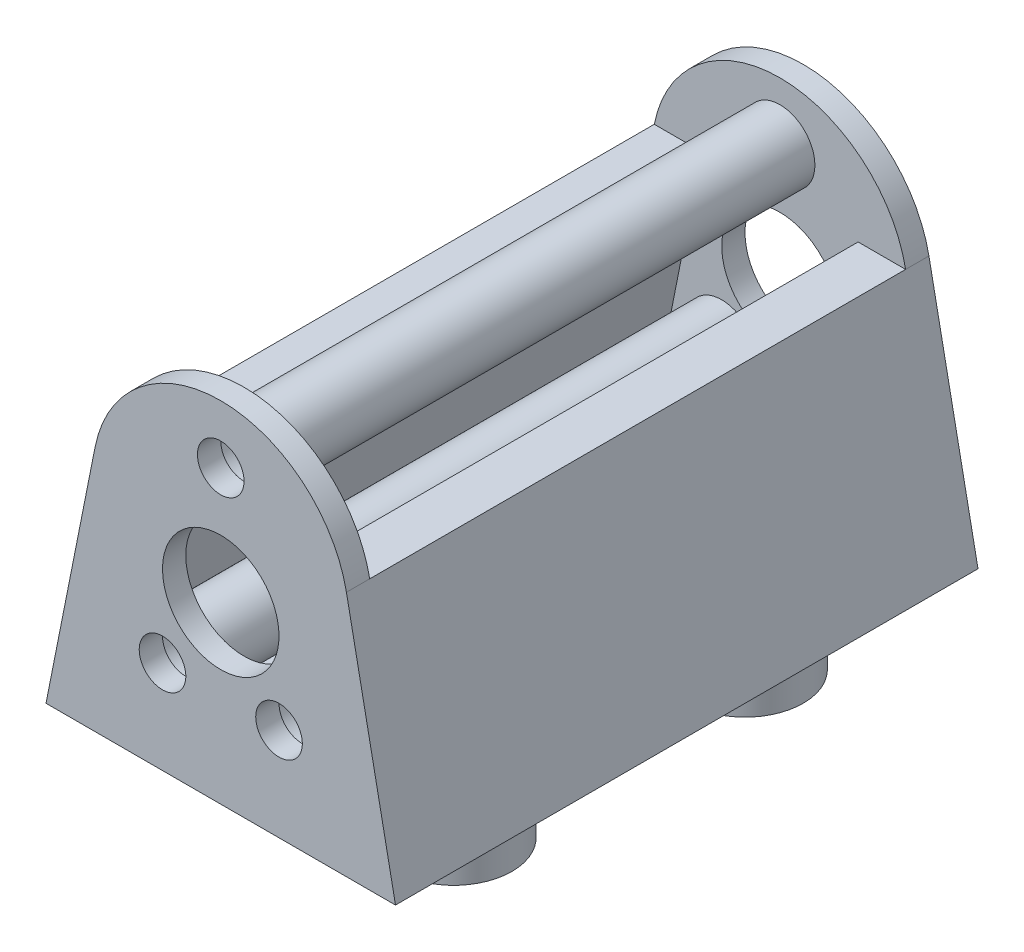
ISO-10303-21;
HEADER;
FILE_DESCRIPTION(('STEP AP214'),'2;1');
FILE_NAME('part.step','',(''),(''),'','','');
FILE_SCHEMA(('AUTOMOTIVE_DESIGN { 1 0 10303 214 1 1 1 1 }'));
ENDSEC;
DATA;
#1=APPLICATION_CONTEXT('core data for automotive mechanical design processes');
#2=APPLICATION_PROTOCOL_DEFINITION('international standard','automotive_design',2000,#1);
#3=PRODUCT_CONTEXT('',#1,'mechanical');
#4=PRODUCT('Part','Part','',(#3));
#5=PRODUCT_RELATED_PRODUCT_CATEGORY('part','',(#4));
#6=PRODUCT_DEFINITION_FORMATION('','',#4);
#7=PRODUCT_DEFINITION_CONTEXT('part definition',#1,'design');
#8=PRODUCT_DEFINITION('design','',#6,#7);
#9=PRODUCT_DEFINITION_SHAPE('','',#8);
#10=(LENGTH_UNIT() NAMED_UNIT(*) SI_UNIT(.MILLI.,.METRE.));
#11=(NAMED_UNIT(*) PLANE_ANGLE_UNIT() SI_UNIT($,.RADIAN.));
#12=(NAMED_UNIT(*) SI_UNIT($,.STERADIAN.) SOLID_ANGLE_UNIT());
#13=UNCERTAINTY_MEASURE_WITH_UNIT(LENGTH_MEASURE(1.E-05),#10,'distance_accuracy_value','');
#14=(GEOMETRIC_REPRESENTATION_CONTEXT(3) GLOBAL_UNCERTAINTY_ASSIGNED_CONTEXT((#13)) GLOBAL_UNIT_ASSIGNED_CONTEXT((#10,
#11,#12)) REPRESENTATION_CONTEXT('',''));
#15=CARTESIAN_POINT('',(0.,0.,0.));
#16=DIRECTION('',(0.,0.,1.));
#17=DIRECTION('',(1.,0.,0.));
#18=AXIS2_PLACEMENT_3D('',#15,#16,#17);
#19=CARTESIAN_POINT('',(0.,19.,2.));
#20=DIRECTION('',(0.,0.,1.));
#21=DIRECTION('',(1.,0.,0.));
#22=AXIS2_PLACEMENT_3D('',#19,#20,#21);
#23=PLANE('',#22);
#24=CARTESIAN_POINT('',(-5.,8.,2.));
#25=DIRECTION('',(0.,0.,1.));
#26=DIRECTION('',(-1.,0.,0.));
#27=AXIS2_PLACEMENT_3D('',#24,#25,#26);
#28=CIRCLE('',#27,3.);
#29=CARTESIAN_POINT('',(-8.,8.,2.));
#30=VERTEX_POINT('',#29);
#31=EDGE_CURVE('E177',#30,#30,#28,.T.);
#32=ORIENTED_EDGE('',*,*,#31,.F.);
#33=EDGE_LOOP('',(#32));
#34=FACE_BOUND('',#33,.T.);
#35=CARTESIAN_POINT('',(0.,25.,2.));
#36=DIRECTION('',(0.,0.,1.));
#37=DIRECTION('',(1.,0.,0.));
#38=AXIS2_PLACEMENT_3D('',#35,#36,#37);
#39=CIRCLE('',#38,3.);
#40=CARTESIAN_POINT('',(3.,25.,2.));
#41=VERTEX_POINT('',#40);
#42=EDGE_CURVE('E183',#41,#41,#39,.T.);
#43=ORIENTED_EDGE('',*,*,#42,.F.);
#44=EDGE_LOOP('',(#43));
#45=FACE_BOUND('',#44,.T.);
#46=CARTESIAN_POINT('',(5.,8.,2.));
#47=DIRECTION('',(0.,0.,1.));
#48=DIRECTION('',(1.,0.,0.));
#49=AXIS2_PLACEMENT_3D('',#46,#47,#48);
#50=CIRCLE('',#49,3.);
#51=CARTESIAN_POINT('',(8.,8.,2.));
#52=VERTEX_POINT('',#51);
#53=EDGE_CURVE('E221',#52,#52,#50,.T.);
#54=ORIENTED_EDGE('',*,*,#53,.F.);
#55=EDGE_LOOP('',(#54));
#56=FACE_BOUND('',#55,.T.);
#57=CARTESIAN_POINT('',(0.,15.,2.));
#58=DIRECTION('',(0.,0.,1.));
#59=DIRECTION('',(1.,0.,0.));
#60=AXIS2_PLACEMENT_3D('',#57,#58,#59);
#61=CIRCLE('',#60,5.);
#62=CARTESIAN_POINT('',(5.,15.,2.));
#63=VERTEX_POINT('',#62);
#64=EDGE_CURVE('E242',#63,#63,#61,.T.);
#65=ORIENTED_EDGE('',*,*,#64,.F.);
#66=EDGE_LOOP('',(#65));
#67=FACE_BOUND('',#66,.T.);
#68=DIRECTION('',(-0.195320613980746,0.980739444375612,0.));
#69=VECTOR('',#68,1.);
#70=CARTESIAN_POINT('',(10.5047900888103,2.09209700053572,2.));
#71=LINE('',#70,#69);
#72=CARTESIAN_POINT('',(10.124818846287,4.00000000000001,2.));
#73=VERTEX_POINT('',#72);
#74=CARTESIAN_POINT('',(6.70957864806325,21.1485267537882,2.));
#75=VERTEX_POINT('',#74);
#76=EDGE_CURVE('E63',#73,#75,#71,.T.);
#77=ORIENTED_EDGE('',*,*,#76,.T.);
#78=DIRECTION('',(-1.,0.,0.));
#79=VECTOR('',#78,1.);
#80=CARTESIAN_POINT('',(0.,21.1485267537882,2.));
#81=LINE('',#80,#79);
#82=CARTESIAN_POINT('',(10.7881338881317,21.1485267537882,2.));
#83=VERTEX_POINT('',#82);
#84=EDGE_CURVE('E331',#83,#75,#81,.T.);
#85=ORIENTED_EDGE('',*,*,#84,.F.);
#86=CARTESIAN_POINT('',(0.,19.,2.));
#87=DIRECTION('',(0.,0.,1.));
#88=DIRECTION('',(1.,0.,0.));
#89=AXIS2_PLACEMENT_3D('',#86,#87,#88);
#90=CIRCLE('',#89,11.);
#91=CARTESIAN_POINT('',(-10.7881338881317,21.1485267537882,2.));
#92=VERTEX_POINT('',#91);
#93=EDGE_CURVE('E254',#83,#92,#90,.T.);
#94=ORIENTED_EDGE('',*,*,#93,.T.);
#95=DIRECTION('',(1.,0.,0.));
#96=VECTOR('',#95,1.);
#97=CARTESIAN_POINT('',(0.,21.1485267537882,2.));
#98=LINE('',#97,#96);
#99=CARTESIAN_POINT('',(-6.70957864806325,21.1485267537882,2.));
#100=VERTEX_POINT('',#99);
#101=EDGE_CURVE('E159',#92,#100,#98,.T.);
#102=ORIENTED_EDGE('',*,*,#101,.T.);
#103=DIRECTION('',(0.195320613980746,0.980739444375612,0.));
#104=VECTOR('',#103,1.);
#105=CARTESIAN_POINT('',(-10.5047900888103,2.09209700053572,2.));
#106=LINE('',#105,#104);
#107=CARTESIAN_POINT('',(-10.124818846287,4.00000000000001,2.));
#108=VERTEX_POINT('',#107);
#109=EDGE_CURVE('E164',#108,#100,#106,.T.);
#110=ORIENTED_EDGE('',*,*,#109,.F.);
#111=DIRECTION('',(-1.,0.,0.));
#112=VECTOR('',#111,1.);
#113=CARTESIAN_POINT('',(0.,4.00000000000001,2.));
#114=LINE('',#113,#112);
#115=EDGE_CURVE('E68',#73,#108,#114,.T.);
#116=ORIENTED_EDGE('',*,*,#115,.F.);
#117=EDGE_LOOP('',(#77,#85,#94,#102,#110,#116));
#118=FACE_BOUND('',#117,.T.);
#119=ADVANCED_FACE('F48',(#34,#45,#56,#67,#118),#23,.T.);
#120=CARTESIAN_POINT('',(0.,19.,48.));
#121=DIRECTION('',(0.,0.,-1.));
#122=DIRECTION('',(-1.,0.,0.));
#123=AXIS2_PLACEMENT_3D('',#120,#121,#122);
#124=PLANE('',#123);
#125=CARTESIAN_POINT('',(-5.,8.,48.));
#126=DIRECTION('',(0.,0.,-1.));
#127=DIRECTION('',(-1.,0.,0.));
#128=AXIS2_PLACEMENT_3D('',#125,#126,#127);
#129=CIRCLE('',#128,3.);
#130=CARTESIAN_POINT('',(-8.,8.,48.));
#131=VERTEX_POINT('',#130);
#132=EDGE_CURVE('E135',#131,#131,#129,.T.);
#133=ORIENTED_EDGE('',*,*,#132,.F.);
#134=EDGE_LOOP('',(#133));
#135=FACE_BOUND('',#134,.T.);
#136=CARTESIAN_POINT('',(0.,25.,48.));
#137=DIRECTION('',(0.,0.,-1.));
#138=DIRECTION('',(-1.,0.,0.));
#139=AXIS2_PLACEMENT_3D('',#136,#137,#138);
#140=CIRCLE('',#139,3.);
#141=CARTESIAN_POINT('',(-3.,25.,48.));
#142=VERTEX_POINT('',#141);
#143=EDGE_CURVE('E180',#142,#142,#140,.T.);
#144=ORIENTED_EDGE('',*,*,#143,.F.);
#145=EDGE_LOOP('',(#144));
#146=FACE_BOUND('',#145,.T.);
#147=CARTESIAN_POINT('',(5.,8.,48.));
#148=DIRECTION('',(0.,0.,-1.));
#149=DIRECTION('',(-1.,0.,0.));
#150=AXIS2_PLACEMENT_3D('',#147,#148,#149);
#151=CIRCLE('',#150,3.);
#152=CARTESIAN_POINT('',(2.,8.,48.));
#153=VERTEX_POINT('',#152);
#154=EDGE_CURVE('E150',#153,#153,#151,.T.);
#155=ORIENTED_EDGE('',*,*,#154,.F.);
#156=EDGE_LOOP('',(#155));
#157=FACE_BOUND('',#156,.T.);
#158=CARTESIAN_POINT('',(0.,15.,48.));
#159=DIRECTION('',(0.,0.,-1.));
#160=DIRECTION('',(-1.,0.,0.));
#161=AXIS2_PLACEMENT_3D('',#158,#159,#160);
#162=CIRCLE('',#161,5.);
#163=CARTESIAN_POINT('',(-5.,15.,48.));
#164=VERTEX_POINT('',#163);
#165=EDGE_CURVE('E189',#164,#164,#162,.T.);
#166=ORIENTED_EDGE('',*,*,#165,.F.);
#167=EDGE_LOOP('',(#166));
#168=FACE_BOUND('',#167,.T.);
#169=CARTESIAN_POINT('',(0.,19.,48.));
#170=DIRECTION('',(0.,0.,-1.));
#171=DIRECTION('',(-1.,0.,0.));
#172=AXIS2_PLACEMENT_3D('',#169,#170,#171);
#173=CIRCLE('',#172,11.);
#174=CARTESIAN_POINT('',(-10.7881338881317,21.1485267537882,48.));
#175=VERTEX_POINT('',#174);
#176=CARTESIAN_POINT('',(10.7881338881317,21.1485267537882,48.));
#177=VERTEX_POINT('',#176);
#178=EDGE_CURVE('E127',#175,#177,#173,.T.);
#179=ORIENTED_EDGE('',*,*,#178,.T.);
#180=DIRECTION('',(1.,0.,0.));
#181=VECTOR('',#180,1.);
#182=CARTESIAN_POINT('',(0.,21.1485267537882,48.));
#183=LINE('',#182,#181);
#184=CARTESIAN_POINT('',(6.70957864806325,21.1485267537882,48.));
#185=VERTEX_POINT('',#184);
#186=EDGE_CURVE('E136',#185,#177,#183,.T.);
#187=ORIENTED_EDGE('',*,*,#186,.F.);
#188=DIRECTION('',(0.195320613980746,-0.980739444375612,0.));
#189=VECTOR('',#188,1.);
#190=CARTESIAN_POINT('',(10.5047900888103,2.09209700053572,48.));
#191=LINE('',#190,#189);
#192=CARTESIAN_POINT('',(10.124818846287,4.00000000000001,48.));
#193=VERTEX_POINT('',#192);
#194=EDGE_CURVE('E333',#185,#193,#191,.T.);
#195=ORIENTED_EDGE('',*,*,#194,.T.);
#196=DIRECTION('',(1.,0.,0.));
#197=VECTOR('',#196,1.);
#198=CARTESIAN_POINT('',(0.,4.00000000000001,48.));
#199=LINE('',#198,#197);
#200=CARTESIAN_POINT('',(-10.124818846287,4.00000000000001,48.));
#201=VERTEX_POINT('',#200);
#202=EDGE_CURVE('E335',#201,#193,#199,.T.);
#203=ORIENTED_EDGE('',*,*,#202,.F.);
#204=DIRECTION('',(-0.195320613980746,-0.980739444375612,0.));
#205=VECTOR('',#204,1.);
#206=CARTESIAN_POINT('',(-10.5047900888103,2.09209700053572,48.));
#207=LINE('',#206,#205);
#208=CARTESIAN_POINT('',(-6.70957864806325,21.1485267537882,48.));
#209=VERTEX_POINT('',#208);
#210=EDGE_CURVE('E130',#209,#201,#207,.T.);
#211=ORIENTED_EDGE('',*,*,#210,.F.);
#212=DIRECTION('',(-1.,0.,0.));
#213=VECTOR('',#212,1.);
#214=CARTESIAN_POINT('',(0.,21.1485267537882,48.));
#215=LINE('',#214,#213);
#216=EDGE_CURVE('E123',#209,#175,#215,.T.);
#217=ORIENTED_EDGE('',*,*,#216,.T.);
#218=EDGE_LOOP('',(#179,#187,#195,#203,#211,#217));
#219=FACE_BOUND('',#218,.T.);
#220=ADVANCED_FACE('F125',(#135,#146,#157,#168,#219),#124,.T.);
#221=CARTESIAN_POINT('',(-5.,8.,2.));
#222=DIRECTION('',(0.,0.,1.));
#223=DIRECTION('',(1.,0.,0.));
#224=AXIS2_PLACEMENT_3D('',#221,#222,#223);
#225=CIRCLE('',#224,2.);
#226=CARTESIAN_POINT('',(-3.,8.,2.));
#227=VERTEX_POINT('',#226);
#228=EDGE_CURVE('E236',#227,#227,#225,.T.);
#229=ORIENTED_EDGE('',*,*,#228,.F.);
#230=EDGE_LOOP('',(#229));
#231=FACE_BOUND('',#230,.T.);
#232=CARTESIAN_POINT('',(-5.,8.,2.));
#233=DIRECTION('',(0.,0.,1.));
#234=DIRECTION('',(1.,0.,0.));
#235=AXIS2_PLACEMENT_3D('',#232,#233,#234);
#236=CIRCLE('',#235,2.5);
#237=CARTESIAN_POINT('',(-2.5,8.,2.));
#238=VERTEX_POINT('',#237);
#239=EDGE_CURVE('E287',#238,#238,#236,.F.);
#240=ORIENTED_EDGE('',*,*,#239,.F.);
#241=EDGE_LOOP('',(#240));
#242=FACE_BOUND('',#241,.T.);
#243=ADVANCED_FACE('F379',(#231,#242),#23,.T.);
#244=CARTESIAN_POINT('',(-5.,8.,48.));
#245=DIRECTION('',(0.,0.,-1.));
#246=DIRECTION('',(-1.,0.,0.));
#247=AXIS2_PLACEMENT_3D('',#244,#245,#246);
#248=CIRCLE('',#247,2.);
#249=CARTESIAN_POINT('',(-7.,8.,48.));
#250=VERTEX_POINT('',#249);
#251=EDGE_CURVE('E201',#250,#250,#248,.T.);
#252=ORIENTED_EDGE('',*,*,#251,.F.);
#253=EDGE_LOOP('',(#252));
#254=FACE_BOUND('',#253,.T.);
#255=CARTESIAN_POINT('',(-5.,8.,48.));
#256=DIRECTION('',(0.,0.,-1.));
#257=DIRECTION('',(-1.,0.,0.));
#258=AXIS2_PLACEMENT_3D('',#255,#256,#257);
#259=CIRCLE('',#258,2.5);
#260=CARTESIAN_POINT('',(-7.5,8.,48.));
#261=VERTEX_POINT('',#260);
#262=EDGE_CURVE('E284',#261,#261,#259,.F.);
#263=ORIENTED_EDGE('',*,*,#262,.F.);
#264=EDGE_LOOP('',(#263));
#265=FACE_BOUND('',#264,.T.);
#266=ADVANCED_FACE('F386',(#254,#265),#124,.T.);
#267=CARTESIAN_POINT('',(0.,25.,2.));
#268=DIRECTION('',(0.,0.,1.));
#269=DIRECTION('',(1.,0.,0.));
#270=AXIS2_PLACEMENT_3D('',#267,#268,#269);
#271=CIRCLE('',#270,2.);
#272=CARTESIAN_POINT('',(2.,25.,2.));
#273=VERTEX_POINT('',#272);
#274=EDGE_CURVE('E230',#273,#273,#271,.T.);
#275=ORIENTED_EDGE('',*,*,#274,.F.);
#276=EDGE_LOOP('',(#275));
#277=FACE_BOUND('',#276,.T.);
#278=CARTESIAN_POINT('',(0.,25.,2.));
#279=DIRECTION('',(0.,0.,1.));
#280=DIRECTION('',(1.,0.,0.));
#281=AXIS2_PLACEMENT_3D('',#278,#279,#280);
#282=CIRCLE('',#281,2.5);
#283=CARTESIAN_POINT('',(2.5,25.,2.));
#284=VERTEX_POINT('',#283);
#285=EDGE_CURVE('E281',#284,#284,#282,.F.);
#286=ORIENTED_EDGE('',*,*,#285,.F.);
#287=EDGE_LOOP('',(#286));
#288=FACE_BOUND('',#287,.T.);
#289=ADVANCED_FACE('F393',(#277,#288),#23,.T.);
#290=CARTESIAN_POINT('',(0.,25.,48.));
#291=DIRECTION('',(0.,0.,-1.));
#292=DIRECTION('',(-1.,0.,0.));
#293=AXIS2_PLACEMENT_3D('',#290,#291,#292);
#294=CIRCLE('',#293,2.);
#295=CARTESIAN_POINT('',(-2.,25.,48.));
#296=VERTEX_POINT('',#295);
#297=EDGE_CURVE('E195',#296,#296,#294,.T.);
#298=ORIENTED_EDGE('',*,*,#297,.F.);
#299=EDGE_LOOP('',(#298));
#300=FACE_BOUND('',#299,.T.);
#301=CARTESIAN_POINT('',(0.,25.,48.));
#302=DIRECTION('',(0.,0.,-1.));
#303=DIRECTION('',(-1.,0.,0.));
#304=AXIS2_PLACEMENT_3D('',#301,#302,#303);
#305=CIRCLE('',#304,2.5);
#306=CARTESIAN_POINT('',(-2.5,25.,48.));
#307=VERTEX_POINT('',#306);
#308=EDGE_CURVE('E278',#307,#307,#305,.F.);
#309=ORIENTED_EDGE('',*,*,#308,.F.);
#310=EDGE_LOOP('',(#309));
#311=FACE_BOUND('',#310,.T.);
#312=ADVANCED_FACE('F395',(#300,#311),#124,.T.);
#313=CARTESIAN_POINT('',(5.,8.,2.));
#314=DIRECTION('',(0.,0.,1.));
#315=DIRECTION('',(1.,0.,0.));
#316=AXIS2_PLACEMENT_3D('',#313,#314,#315);
#317=CIRCLE('',#316,2.);
#318=CARTESIAN_POINT('',(7.,8.,2.));
#319=VERTEX_POINT('',#318);
#320=EDGE_CURVE('E248',#319,#319,#317,.T.);
#321=ORIENTED_EDGE('',*,*,#320,.F.);
#322=EDGE_LOOP('',(#321));
#323=FACE_BOUND('',#322,.T.);
#324=CARTESIAN_POINT('',(5.,8.,2.));
#325=DIRECTION('',(0.,0.,1.));
#326=DIRECTION('',(1.,0.,0.));
#327=AXIS2_PLACEMENT_3D('',#324,#325,#326);
#328=CIRCLE('',#327,2.5);
#329=CARTESIAN_POINT('',(7.5,8.,2.));
#330=VERTEX_POINT('',#329);
#331=EDGE_CURVE('E275',#330,#330,#328,.F.);
#332=ORIENTED_EDGE('',*,*,#331,.F.);
#333=EDGE_LOOP('',(#332));
#334=FACE_BOUND('',#333,.T.);
#335=ADVANCED_FACE('F380',(#323,#334),#23,.T.);
#336=CARTESIAN_POINT('',(0.,19.,0.));
#337=DIRECTION('',(0.,0.,1.));
#338=DIRECTION('',(1.,0.,0.));
#339=AXIS2_PLACEMENT_3D('',#336,#337,#338);
#340=PLANE('',#339);
#341=DIRECTION('',(-0.195320613980746,0.980739444375612,0.));
#342=VECTOR('',#341,1.);
#343=CARTESIAN_POINT('',(15.,0.,0.));
#344=LINE('',#343,#342);
#345=CARTESIAN_POINT('',(15.,0.,0.));
#346=VERTEX_POINT('',#345);
#347=CARTESIAN_POINT('',(10.7881338881317,21.1485267537882,0.));
#348=VERTEX_POINT('',#347);
#349=EDGE_CURVE('E251',#346,#348,#344,.T.);
#350=ORIENTED_EDGE('',*,*,#349,.F.);
#351=DIRECTION('',(1.,0.,0.));
#352=VECTOR('',#351,1.);
#353=CARTESIAN_POINT('',(-15.,0.,0.));
#354=LINE('',#353,#352);
#355=CARTESIAN_POINT('',(-15.,0.,0.));
#356=VERTEX_POINT('',#355);
#357=EDGE_CURVE('E257',#356,#346,#354,.T.);
#358=ORIENTED_EDGE('',*,*,#357,.F.);
#359=DIRECTION('',(-0.195320613980746,-0.980739444375612,0.));
#360=VECTOR('',#359,1.);
#361=CARTESIAN_POINT('',(-15.,0.,0.));
#362=LINE('',#361,#360);
#363=CARTESIAN_POINT('',(-10.7881338881317,21.1485267537882,0.));
#364=VERTEX_POINT('',#363);
#365=EDGE_CURVE('E262',#364,#356,#362,.T.);
#366=ORIENTED_EDGE('',*,*,#365,.F.);
#367=CARTESIAN_POINT('',(0.,19.,0.));
#368=DIRECTION('',(0.,0.,1.));
#369=DIRECTION('',(1.,0.,0.));
#370=AXIS2_PLACEMENT_3D('',#367,#368,#369);
#371=CIRCLE('',#370,11.);
#372=EDGE_CURVE('E260',#348,#364,#371,.T.);
#373=ORIENTED_EDGE('',*,*,#372,.F.);
#374=EDGE_LOOP('',(#350,#358,#366,#373));
#375=FACE_BOUND('',#374,.T.);
#376=CARTESIAN_POINT('',(5.,8.,0.));
#377=DIRECTION('',(0.,0.,1.));
#378=DIRECTION('',(1.,0.,0.));
#379=AXIS2_PLACEMENT_3D('',#376,#377,#378);
#380=CIRCLE('',#379,2.);
#381=CARTESIAN_POINT('',(7.,8.,0.));
#382=VERTEX_POINT('',#381);
#383=EDGE_CURVE('E245',#382,#382,#380,.T.);
#384=ORIENTED_EDGE('',*,*,#383,.T.);
#385=EDGE_LOOP('',(#384));
#386=FACE_BOUND('',#385,.T.);
#387=CARTESIAN_POINT('',(0.,15.,0.));
#388=DIRECTION('',(0.,0.,1.));
#389=DIRECTION('',(1.,0.,0.));
#390=AXIS2_PLACEMENT_3D('',#387,#388,#389);
#391=CIRCLE('',#390,5.);
#392=CARTESIAN_POINT('',(5.,15.,0.));
#393=VERTEX_POINT('',#392);
#394=EDGE_CURVE('E239',#393,#393,#391,.T.);
#395=ORIENTED_EDGE('',*,*,#394,.T.);
#396=EDGE_LOOP('',(#395));
#397=FACE_BOUND('',#396,.T.);
#398=CARTESIAN_POINT('',(-5.,8.,0.));
#399=DIRECTION('',(0.,0.,1.));
#400=DIRECTION('',(1.,0.,0.));
#401=AXIS2_PLACEMENT_3D('',#398,#399,#400);
#402=CIRCLE('',#401,2.);
#403=CARTESIAN_POINT('',(-3.,8.,0.));
#404=VERTEX_POINT('',#403);
#405=EDGE_CURVE('E233',#404,#404,#402,.T.);
#406=ORIENTED_EDGE('',*,*,#405,.T.);
#407=EDGE_LOOP('',(#406));
#408=FACE_BOUND('',#407,.T.);
#409=CARTESIAN_POINT('',(0.,25.,0.));
#410=DIRECTION('',(0.,0.,1.));
#411=DIRECTION('',(1.,0.,0.));
#412=AXIS2_PLACEMENT_3D('',#409,#410,#411);
#413=CIRCLE('',#412,2.);
#414=CARTESIAN_POINT('',(2.,25.,0.));
#415=VERTEX_POINT('',#414);
#416=EDGE_CURVE('E229',#415,#415,#413,.T.);
#417=ORIENTED_EDGE('',*,*,#416,.T.);
#418=EDGE_LOOP('',(#417));
#419=FACE_BOUND('',#418,.T.);
#420=ADVANCED_FACE('F320',(#375,#386,#397,#408,#419),#340,.F.);
#421=CARTESIAN_POINT('',(15.,0.,2.));
#422=DIRECTION('',(-0.980739444375612,-0.195320613980746,0.));
#423=DIRECTION('',(0.195320613980746,-0.980739444375612,0.));
#424=AXIS2_PLACEMENT_3D('',#421,#422,#423);
#425=PLANE('',#424);
#426=ORIENTED_EDGE('',*,*,#349,.T.);
#427=DIRECTION('',(0.,0.,-1.));
#428=VECTOR('',#427,1.);
#429=CARTESIAN_POINT('',(10.7881338881317,21.1485267537882,2.));
#430=LINE('',#429,#428);
#431=EDGE_CURVE('E272',#83,#348,#430,.T.);
#432=ORIENTED_EDGE('',*,*,#431,.F.);
#433=DIRECTION('',(0.,0.,-1.));
#434=VECTOR('',#433,1.);
#435=CARTESIAN_POINT('',(10.7881338881317,21.1485267537882,84.7050430302935));
#436=LINE('',#435,#434);
#437=EDGE_CURVE('E174',#177,#83,#436,.T.);
#438=ORIENTED_EDGE('',*,*,#437,.F.);
#439=DIRECTION('',(0.,0.,1.));
#440=VECTOR('',#439,1.);
#441=CARTESIAN_POINT('',(10.7881338881317,21.1485267537882,48.));
#442=LINE('',#441,#440);
#443=CARTESIAN_POINT('',(10.7881338881317,21.1485267537882,50.));
#444=VERTEX_POINT('',#443);
#445=EDGE_CURVE('E151',#177,#444,#442,.T.);
#446=ORIENTED_EDGE('',*,*,#445,.T.);
#447=DIRECTION('',(0.195320613980746,-0.980739444375612,0.));
#448=VECTOR('',#447,1.);
#449=CARTESIAN_POINT('',(10.7881338881317,21.1485267537882,50.));
#450=LINE('',#449,#448);
#451=CARTESIAN_POINT('',(15.,0.,50.));
#452=VERTEX_POINT('',#451);
#453=EDGE_CURVE('E156',#444,#452,#450,.T.);
#454=ORIENTED_EDGE('',*,*,#453,.T.);
#455=DIRECTION('',(0.,0.,-1.));
#456=VECTOR('',#455,1.);
#457=CARTESIAN_POINT('',(15.,0.,2.));
#458=LINE('',#457,#456);
#459=EDGE_CURVE('E256',#452,#346,#458,.T.);
#460=ORIENTED_EDGE('',*,*,#459,.T.);
#461=EDGE_LOOP('',(#426,#432,#438,#446,#454,#460));
#462=FACE_BOUND('',#461,.T.);
#463=ADVANCED_FACE('F50',(#462),#425,.F.);
#464=CARTESIAN_POINT('',(0.,19.,2.));
#465=DIRECTION('',(0.,0.,-1.));
#466=DIRECTION('',(-1.,0.,0.));
#467=AXIS2_PLACEMENT_3D('',#464,#465,#466);
#468=CYLINDRICAL_SURFACE('',#467,11.);
#469=ORIENTED_EDGE('',*,*,#372,.T.);
#470=DIRECTION('',(0.,0.,-1.));
#471=VECTOR('',#470,1.);
#472=CARTESIAN_POINT('',(-10.7881338881317,21.1485267537882,2.));
#473=LINE('',#472,#471);
#474=EDGE_CURVE('E270',#92,#364,#473,.T.);
#475=ORIENTED_EDGE('',*,*,#474,.F.);
#476=ORIENTED_EDGE('',*,*,#93,.F.);
#477=ORIENTED_EDGE('',*,*,#431,.T.);
#478=EDGE_LOOP('',(#469,#475,#476,#477));
#479=FACE_BOUND('',#478,.T.);
#480=ADVANCED_FACE('F325',(#479),#468,.T.);
#481=CARTESIAN_POINT('',(-15.,0.,2.));
#482=DIRECTION('',(0.980739444375612,-0.195320613980746,0.));
#483=DIRECTION('',(0.195320613980746,0.980739444375612,0.));
#484=AXIS2_PLACEMENT_3D('',#481,#482,#483);
#485=PLANE('',#484);
#486=ORIENTED_EDGE('',*,*,#365,.T.);
#487=DIRECTION('',(0.,0.,-1.));
#488=VECTOR('',#487,1.);
#489=CARTESIAN_POINT('',(-15.,0.,2.));
#490=LINE('',#489,#488);
#491=CARTESIAN_POINT('',(-15.,0.,50.));
#492=VERTEX_POINT('',#491);
#493=EDGE_CURVE('E267',#492,#356,#490,.T.);
#494=ORIENTED_EDGE('',*,*,#493,.F.);
#495=DIRECTION('',(0.195320613980746,0.980739444375612,0.));
#496=VECTOR('',#495,1.);
#497=CARTESIAN_POINT('',(-15.,0.,50.));
#498=LINE('',#497,#496);
#499=CARTESIAN_POINT('',(-10.7881338881317,21.1485267537882,50.));
#500=VERTEX_POINT('',#499);
#501=EDGE_CURVE('E147',#492,#500,#498,.T.);
#502=ORIENTED_EDGE('',*,*,#501,.T.);
#503=DIRECTION('',(0.,0.,1.));
#504=VECTOR('',#503,1.);
#505=CARTESIAN_POINT('',(-10.7881338881317,21.1485267537882,48.));
#506=LINE('',#505,#504);
#507=EDGE_CURVE('E141',#175,#500,#506,.T.);
#508=ORIENTED_EDGE('',*,*,#507,.F.);
#509=DIRECTION('',(0.,0.,-1.));
#510=VECTOR('',#509,1.);
#511=CARTESIAN_POINT('',(-10.7881338881317,21.1485267537882,84.7050430302935));
#512=LINE('',#511,#510);
#513=EDGE_CURVE('E144',#175,#92,#512,.T.);
#514=ORIENTED_EDGE('',*,*,#513,.T.);
#515=ORIENTED_EDGE('',*,*,#474,.T.);
#516=EDGE_LOOP('',(#486,#494,#502,#508,#514,#515));
#517=FACE_BOUND('',#516,.T.);
#518=ADVANCED_FACE('F142',(#517),#485,.F.);
#519=CARTESIAN_POINT('',(-15.,0.,2.));
#520=DIRECTION('',(0.,1.,0.));
#521=DIRECTION('',(0.,0.,1.));
#522=AXIS2_PLACEMENT_3D('',#519,#520,#521);
#523=PLANE('',#522);
#524=CARTESIAN_POINT('',(-7.5,0.,37.5));
#525=DIRECTION('',(0.,1.,0.));
#526=DIRECTION('',(0.,0.,1.));
#527=AXIS2_PLACEMENT_3D('',#524,#525,#526);
#528=CIRCLE('',#527,5.);
#529=CARTESIAN_POINT('',(-7.5,0.,42.5));
#530=VERTEX_POINT('',#529);
#531=EDGE_CURVE('E13',#530,#530,#528,.F.);
#532=ORIENTED_EDGE('',*,*,#531,.F.);
#533=EDGE_LOOP('',(#532));
#534=FACE_BOUND('',#533,.T.);
#535=CARTESIAN_POINT('',(-7.5,0.,12.5));
#536=DIRECTION('',(0.,1.,0.));
#537=DIRECTION('',(0.,0.,1.));
#538=AXIS2_PLACEMENT_3D('',#535,#536,#537);
#539=CIRCLE('',#538,5.);
#540=CARTESIAN_POINT('',(-7.5,0.,17.5));
#541=VERTEX_POINT('',#540);
#542=EDGE_CURVE('E56',#541,#541,#539,.F.);
#543=ORIENTED_EDGE('',*,*,#542,.F.);
#544=EDGE_LOOP('',(#543));
#545=FACE_BOUND('',#544,.T.);
#546=CARTESIAN_POINT('',(7.5,0.,12.5));
#547=DIRECTION('',(0.,1.,0.));
#548=DIRECTION('',(0.,0.,1.));
#549=AXIS2_PLACEMENT_3D('',#546,#547,#548);
#550=CIRCLE('',#549,5.);
#551=CARTESIAN_POINT('',(7.5,0.,17.5));
#552=VERTEX_POINT('',#551);
#553=EDGE_CURVE('E293',#552,#552,#550,.F.);
#554=ORIENTED_EDGE('',*,*,#553,.F.);
#555=EDGE_LOOP('',(#554));
#556=FACE_BOUND('',#555,.T.);
#557=CARTESIAN_POINT('',(7.5,0.,37.5));
#558=DIRECTION('',(0.,1.,0.));
#559=DIRECTION('',(0.,0.,1.));
#560=AXIS2_PLACEMENT_3D('',#557,#558,#559);
#561=CIRCLE('',#560,5.);
#562=CARTESIAN_POINT('',(7.5,0.,42.5));
#563=VERTEX_POINT('',#562);
#564=EDGE_CURVE('E290',#563,#563,#561,.F.);
#565=ORIENTED_EDGE('',*,*,#564,.F.);
#566=EDGE_LOOP('',(#565));
#567=FACE_BOUND('',#566,.T.);
#568=ORIENTED_EDGE('',*,*,#357,.T.);
#569=ORIENTED_EDGE('',*,*,#459,.F.);
#570=DIRECTION('',(-1.,0.,0.));
#571=VECTOR('',#570,1.);
#572=CARTESIAN_POINT('',(15.,0.,50.));
#573=LINE('',#572,#571);
#574=EDGE_CURVE('E210',#452,#492,#573,.T.);
#575=ORIENTED_EDGE('',*,*,#574,.T.);
#576=ORIENTED_EDGE('',*,*,#493,.T.);
#577=EDGE_LOOP('',(#568,#569,#575,#576));
#578=FACE_BOUND('',#577,.T.);
#579=ADVANCED_FACE('F300',(#534,#545,#556,#567,#578),#523,.F.);
#580=CARTESIAN_POINT('',(5.,8.,2.));
#581=DIRECTION('',(0.,0.,-1.));
#582=DIRECTION('',(-1.,0.,0.));
#583=AXIS2_PLACEMENT_3D('',#580,#581,#582);
#584=CYLINDRICAL_SURFACE('',#583,2.);
#585=ORIENTED_EDGE('',*,*,#320,.T.);
#586=EDGE_LOOP('',(#585));
#587=FACE_BOUND('',#586,.T.);
#588=ORIENTED_EDGE('',*,*,#383,.F.);
#589=EDGE_LOOP('',(#588));
#590=FACE_BOUND('',#589,.T.);
#591=ADVANCED_FACE('F303',(#587,#590),#584,.F.);
#592=CARTESIAN_POINT('',(0.,15.,2.));
#593=DIRECTION('',(0.,0.,-1.));
#594=DIRECTION('',(-1.,0.,0.));
#595=AXIS2_PLACEMENT_3D('',#592,#593,#594);
#596=CYLINDRICAL_SURFACE('',#595,5.);
#597=ORIENTED_EDGE('',*,*,#64,.T.);
#598=EDGE_LOOP('',(#597));
#599=FACE_BOUND('',#598,.T.);
#600=ORIENTED_EDGE('',*,*,#394,.F.);
#601=EDGE_LOOP('',(#600));
#602=FACE_BOUND('',#601,.T.);
#603=ADVANCED_FACE('F430',(#599,#602),#596,.F.);
#604=CARTESIAN_POINT('',(-5.,8.,2.));
#605=DIRECTION('',(0.,0.,-1.));
#606=DIRECTION('',(-1.,0.,0.));
#607=AXIS2_PLACEMENT_3D('',#604,#605,#606);
#608=CYLINDRICAL_SURFACE('',#607,2.);
#609=ORIENTED_EDGE('',*,*,#228,.T.);
#610=EDGE_LOOP('',(#609));
#611=FACE_BOUND('',#610,.T.);
#612=ORIENTED_EDGE('',*,*,#405,.F.);
#613=EDGE_LOOP('',(#612));
#614=FACE_BOUND('',#613,.T.);
#615=ADVANCED_FACE('F419',(#611,#614),#608,.F.);
#616=CARTESIAN_POINT('',(0.,25.,2.));
#617=DIRECTION('',(0.,0.,-1.));
#618=DIRECTION('',(-1.,0.,0.));
#619=AXIS2_PLACEMENT_3D('',#616,#617,#618);
#620=CYLINDRICAL_SURFACE('',#619,2.);
#621=ORIENTED_EDGE('',*,*,#274,.T.);
#622=EDGE_LOOP('',(#621));
#623=FACE_BOUND('',#622,.T.);
#624=ORIENTED_EDGE('',*,*,#416,.F.);
#625=EDGE_LOOP('',(#624));
#626=FACE_BOUND('',#625,.T.);
#627=ADVANCED_FACE('F415',(#623,#626),#620,.F.);
#628=CARTESIAN_POINT('',(5.,8.,56.4852813742386));
#629=DIRECTION('',(0.,0.,-1.));
#630=DIRECTION('',(-1.,0.,0.));
#631=AXIS2_PLACEMENT_3D('',#628,#629,#630);
#632=CYLINDRICAL_SURFACE('',#631,3.);
#633=ORIENTED_EDGE('',*,*,#154,.T.);
#634=EDGE_LOOP('',(#633));
#635=FACE_BOUND('',#634,.T.);
#636=ORIENTED_EDGE('',*,*,#53,.T.);
#637=EDGE_LOOP('',(#636));
#638=FACE_BOUND('',#637,.T.);
#639=ADVANCED_FACE('F418',(#635,#638),#632,.T.);
#640=CARTESIAN_POINT('',(5.,8.,56.4852813742386));
#641=DIRECTION('',(0.,0.,-1.));
#642=DIRECTION('',(-1.,0.,0.));
#643=AXIS2_PLACEMENT_3D('',#640,#641,#642);
#644=CYLINDRICAL_SURFACE('',#643,2.5);
#645=CARTESIAN_POINT('',(5.,8.,48.));
#646=DIRECTION('',(0.,0.,-1.));
#647=DIRECTION('',(-1.,0.,0.));
#648=AXIS2_PLACEMENT_3D('',#645,#646,#647);
#649=CIRCLE('',#648,2.5);
#650=CARTESIAN_POINT('',(2.5,8.,48.));
#651=VERTEX_POINT('',#650);
#652=EDGE_CURVE('E224',#651,#651,#649,.T.);
#653=ORIENTED_EDGE('',*,*,#652,.F.);
#654=EDGE_LOOP('',(#653));
#655=FACE_BOUND('',#654,.T.);
#656=ORIENTED_EDGE('',*,*,#331,.T.);
#657=EDGE_LOOP('',(#656));
#658=FACE_BOUND('',#657,.T.);
#659=ADVANCED_FACE('F427',(#655,#658),#644,.F.);
#660=CARTESIAN_POINT('',(5.,8.,48.));
#661=DIRECTION('',(0.,0.,-1.));
#662=DIRECTION('',(-1.,0.,0.));
#663=AXIS2_PLACEMENT_3D('',#660,#661,#662);
#664=CIRCLE('',#663,2.);
#665=CARTESIAN_POINT('',(3.,8.,48.));
#666=VERTEX_POINT('',#665);
#667=EDGE_CURVE('E207',#666,#666,#664,.T.);
#668=ORIENTED_EDGE('',*,*,#667,.F.);
#669=EDGE_LOOP('',(#668));
#670=FACE_BOUND('',#669,.T.);
#671=ORIENTED_EDGE('',*,*,#652,.T.);
#672=EDGE_LOOP('',(#671));
#673=FACE_BOUND('',#672,.T.);
#674=ADVANCED_FACE('F350',(#670,#673),#124,.T.);
#675=CARTESIAN_POINT('',(0.,19.,50.));
#676=DIRECTION('',(0.,0.,-1.));
#677=DIRECTION('',(-1.,0.,0.));
#678=AXIS2_PLACEMENT_3D('',#675,#676,#677);
#679=PLANE('',#678);
#680=ORIENTED_EDGE('',*,*,#574,.F.);
#681=ORIENTED_EDGE('',*,*,#453,.F.);
#682=CARTESIAN_POINT('',(0.,19.,50.));
#683=DIRECTION('',(0.,0.,-1.));
#684=DIRECTION('',(-1.,0.,0.));
#685=AXIS2_PLACEMENT_3D('',#682,#683,#684);
#686=CIRCLE('',#685,11.);
#687=EDGE_CURVE('E216',#500,#444,#686,.T.);
#688=ORIENTED_EDGE('',*,*,#687,.F.);
#689=ORIENTED_EDGE('',*,*,#501,.F.);
#690=EDGE_LOOP('',(#680,#681,#688,#689));
#691=FACE_BOUND('',#690,.T.);
#692=CARTESIAN_POINT('',(5.,8.,50.));
#693=DIRECTION('',(0.,0.,-1.));
#694=DIRECTION('',(-1.,0.,0.));
#695=AXIS2_PLACEMENT_3D('',#692,#693,#694);
#696=CIRCLE('',#695,2.);
#697=CARTESIAN_POINT('',(3.,8.,50.));
#698=VERTEX_POINT('',#697);
#699=EDGE_CURVE('E204',#698,#698,#696,.T.);
#700=ORIENTED_EDGE('',*,*,#699,.T.);
#701=EDGE_LOOP('',(#700));
#702=FACE_BOUND('',#701,.T.);
#703=CARTESIAN_POINT('',(-5.,8.,50.));
#704=DIRECTION('',(0.,0.,-1.));
#705=DIRECTION('',(-1.,0.,0.));
#706=AXIS2_PLACEMENT_3D('',#703,#704,#705);
#707=CIRCLE('',#706,2.);
#708=CARTESIAN_POINT('',(-7.,8.,50.));
#709=VERTEX_POINT('',#708);
#710=EDGE_CURVE('E198',#709,#709,#707,.T.);
#711=ORIENTED_EDGE('',*,*,#710,.T.);
#712=EDGE_LOOP('',(#711));
#713=FACE_BOUND('',#712,.T.);
#714=CARTESIAN_POINT('',(0.,25.,50.));
#715=DIRECTION('',(0.,0.,-1.));
#716=DIRECTION('',(-1.,0.,0.));
#717=AXIS2_PLACEMENT_3D('',#714,#715,#716);
#718=CIRCLE('',#717,2.);
#719=CARTESIAN_POINT('',(-2.,25.,50.));
#720=VERTEX_POINT('',#719);
#721=EDGE_CURVE('E192',#720,#720,#718,.T.);
#722=ORIENTED_EDGE('',*,*,#721,.T.);
#723=EDGE_LOOP('',(#722));
#724=FACE_BOUND('',#723,.T.);
#725=CARTESIAN_POINT('',(0.,15.,50.));
#726=DIRECTION('',(0.,0.,-1.));
#727=DIRECTION('',(-1.,0.,0.));
#728=AXIS2_PLACEMENT_3D('',#725,#726,#727);
#729=CIRCLE('',#728,5.);
#730=CARTESIAN_POINT('',(-5.,15.,50.));
#731=VERTEX_POINT('',#730);
#732=EDGE_CURVE('E186',#731,#731,#729,.T.);
#733=ORIENTED_EDGE('',*,*,#732,.T.);
#734=EDGE_LOOP('',(#733));
#735=FACE_BOUND('',#734,.T.);
#736=ADVANCED_FACE('F347',(#691,#702,#713,#724,#735),#679,.F.);
#737=CARTESIAN_POINT('',(0.,19.,48.));
#738=DIRECTION('',(0.,0.,1.));
#739=DIRECTION('',(1.,0.,0.));
#740=AXIS2_PLACEMENT_3D('',#737,#738,#739);
#741=CYLINDRICAL_SURFACE('',#740,11.);
#742=ORIENTED_EDGE('',*,*,#687,.T.);
#743=ORIENTED_EDGE('',*,*,#445,.F.);
#744=ORIENTED_EDGE('',*,*,#178,.F.);
#745=ORIENTED_EDGE('',*,*,#507,.T.);
#746=EDGE_LOOP('',(#742,#743,#744,#745));
#747=FACE_BOUND('',#746,.T.);
#748=ADVANCED_FACE('F153',(#747),#741,.T.);
#749=CARTESIAN_POINT('',(5.,8.,48.));
#750=DIRECTION('',(0.,0.,1.));
#751=DIRECTION('',(1.,0.,0.));
#752=AXIS2_PLACEMENT_3D('',#749,#750,#751);
#753=CYLINDRICAL_SURFACE('',#752,2.);
#754=ORIENTED_EDGE('',*,*,#667,.T.);
#755=EDGE_LOOP('',(#754));
#756=FACE_BOUND('',#755,.T.);
#757=ORIENTED_EDGE('',*,*,#699,.F.);
#758=EDGE_LOOP('',(#757));
#759=FACE_BOUND('',#758,.T.);
#760=ADVANCED_FACE('F528',(#756,#759),#753,.F.);
#761=CARTESIAN_POINT('',(-5.,8.,48.));
#762=DIRECTION('',(0.,0.,1.));
#763=DIRECTION('',(1.,0.,0.));
#764=AXIS2_PLACEMENT_3D('',#761,#762,#763);
#765=CYLINDRICAL_SURFACE('',#764,2.);
#766=ORIENTED_EDGE('',*,*,#251,.T.);
#767=EDGE_LOOP('',(#766));
#768=FACE_BOUND('',#767,.T.);
#769=ORIENTED_EDGE('',*,*,#710,.F.);
#770=EDGE_LOOP('',(#769));
#771=FACE_BOUND('',#770,.T.);
#772=ADVANCED_FACE('F373',(#768,#771),#765,.F.);
#773=CARTESIAN_POINT('',(0.,25.,48.));
#774=DIRECTION('',(0.,0.,1.));
#775=DIRECTION('',(1.,0.,0.));
#776=AXIS2_PLACEMENT_3D('',#773,#774,#775);
#777=CYLINDRICAL_SURFACE('',#776,2.);
#778=ORIENTED_EDGE('',*,*,#297,.T.);
#779=EDGE_LOOP('',(#778));
#780=FACE_BOUND('',#779,.T.);
#781=ORIENTED_EDGE('',*,*,#721,.F.);
#782=EDGE_LOOP('',(#781));
#783=FACE_BOUND('',#782,.T.);
#784=ADVANCED_FACE('F363',(#780,#783),#777,.F.);
#785=CARTESIAN_POINT('',(0.,15.,48.));
#786=DIRECTION('',(0.,0.,1.));
#787=DIRECTION('',(1.,0.,0.));
#788=AXIS2_PLACEMENT_3D('',#785,#786,#787);
#789=CYLINDRICAL_SURFACE('',#788,5.);
#790=ORIENTED_EDGE('',*,*,#165,.T.);
#791=EDGE_LOOP('',(#790));
#792=FACE_BOUND('',#791,.T.);
#793=ORIENTED_EDGE('',*,*,#732,.F.);
#794=EDGE_LOOP('',(#793));
#795=FACE_BOUND('',#794,.T.);
#796=ADVANCED_FACE('F360',(#792,#795),#789,.F.);
#797=CARTESIAN_POINT('',(0.,25.,56.4852813742386));
#798=DIRECTION('',(0.,0.,-1.));
#799=DIRECTION('',(-1.,0.,0.));
#800=AXIS2_PLACEMENT_3D('',#797,#798,#799);
#801=CYLINDRICAL_SURFACE('',#800,2.5);
#802=ORIENTED_EDGE('',*,*,#308,.T.);
#803=EDGE_LOOP('',(#802));
#804=FACE_BOUND('',#803,.T.);
#805=ORIENTED_EDGE('',*,*,#285,.T.);
#806=EDGE_LOOP('',(#805));
#807=FACE_BOUND('',#806,.T.);
#808=ADVANCED_FACE('F362',(#804,#807),#801,.F.);
#809=CARTESIAN_POINT('',(0.,25.,56.4852813742386));
#810=DIRECTION('',(0.,0.,-1.));
#811=DIRECTION('',(-1.,0.,0.));
#812=AXIS2_PLACEMENT_3D('',#809,#810,#811);
#813=CYLINDRICAL_SURFACE('',#812,3.);
#814=ORIENTED_EDGE('',*,*,#143,.T.);
#815=EDGE_LOOP('',(#814));
#816=FACE_BOUND('',#815,.T.);
#817=ORIENTED_EDGE('',*,*,#42,.T.);
#818=EDGE_LOOP('',(#817));
#819=FACE_BOUND('',#818,.T.);
#820=ADVANCED_FACE('F370',(#816,#819),#813,.T.);
#821=CARTESIAN_POINT('',(-5.,8.,56.4852813742386));
#822=DIRECTION('',(0.,0.,-1.));
#823=DIRECTION('',(-1.,0.,0.));
#824=AXIS2_PLACEMENT_3D('',#821,#822,#823);
#825=CYLINDRICAL_SURFACE('',#824,2.5);
#826=ORIENTED_EDGE('',*,*,#262,.T.);
#827=EDGE_LOOP('',(#826));
#828=FACE_BOUND('',#827,.T.);
#829=ORIENTED_EDGE('',*,*,#239,.T.);
#830=EDGE_LOOP('',(#829));
#831=FACE_BOUND('',#830,.T.);
#832=ADVANCED_FACE('F565',(#828,#831),#825,.F.);
#833=CARTESIAN_POINT('',(-5.,8.,56.4852813742386));
#834=DIRECTION('',(0.,0.,-1.));
#835=DIRECTION('',(-1.,0.,0.));
#836=AXIS2_PLACEMENT_3D('',#833,#834,#835);
#837=CYLINDRICAL_SURFACE('',#836,3.);
#838=ORIENTED_EDGE('',*,*,#132,.T.);
#839=EDGE_LOOP('',(#838));
#840=FACE_BOUND('',#839,.T.);
#841=ORIENTED_EDGE('',*,*,#31,.T.);
#842=EDGE_LOOP('',(#841));
#843=FACE_BOUND('',#842,.T.);
#844=ADVANCED_FACE('F575',(#840,#843),#837,.T.);
#845=CARTESIAN_POINT('',(0.,21.1485267537882,84.7050430302935));
#846=DIRECTION('',(0.,-1.,0.));
#847=DIRECTION('',(0.,0.,-1.));
#848=AXIS2_PLACEMENT_3D('',#845,#846,#847);
#849=PLANE('',#848);
#850=DIRECTION('',(0.,0.,-1.));
#851=VECTOR('',#850,1.);
#852=CARTESIAN_POINT('',(6.70957864806325,21.1485267537882,84.7050430302935));
#853=LINE('',#852,#851);
#854=EDGE_CURVE('E172',#185,#75,#853,.T.);
#855=ORIENTED_EDGE('',*,*,#854,.F.);
#856=ORIENTED_EDGE('',*,*,#186,.T.);
#857=ORIENTED_EDGE('',*,*,#437,.T.);
#858=ORIENTED_EDGE('',*,*,#84,.T.);
#859=EDGE_LOOP('',(#855,#856,#857,#858));
#860=FACE_BOUND('',#859,.T.);
#861=ADVANCED_FACE('F330',(#860),#849,.F.);
#862=CARTESIAN_POINT('',(10.5047900888103,2.09209700053572,84.7050430302935));
#863=DIRECTION('',(-0.980739444375612,-0.195320613980746,0.));
#864=DIRECTION('',(0.195320613980746,-0.980739444375612,0.));
#865=AXIS2_PLACEMENT_3D('',#862,#863,#864);
#866=PLANE('',#865);
#867=ORIENTED_EDGE('',*,*,#194,.F.);
#868=ORIENTED_EDGE('',*,*,#854,.T.);
#869=ORIENTED_EDGE('',*,*,#76,.F.);
#870=DIRECTION('',(0.,0.,-1.));
#871=VECTOR('',#870,1.);
#872=CARTESIAN_POINT('',(10.124818846287,4.00000000000001,84.7050430302935));
#873=LINE('',#872,#871);
#874=EDGE_CURVE('E170',#193,#73,#873,.T.);
#875=ORIENTED_EDGE('',*,*,#874,.F.);
#876=EDGE_LOOP('',(#867,#868,#869,#875));
#877=FACE_BOUND('',#876,.T.);
#878=ADVANCED_FACE('F638',(#877),#866,.T.);
#879=CARTESIAN_POINT('',(0.,4.00000000000001,84.7050430302935));
#880=DIRECTION('',(0.,-1.,0.));
#881=DIRECTION('',(1.,0.,0.));
#882=AXIS2_PLACEMENT_3D('',#879,#880,#881);
#883=PLANE('',#882);
#884=DIRECTION('',(0.,0.,-1.));
#885=VECTOR('',#884,1.);
#886=CARTESIAN_POINT('',(-10.124818846287,4.00000000000001,84.7050430302935));
#887=LINE('',#886,#885);
#888=EDGE_CURVE('E162',#201,#108,#887,.T.);
#889=ORIENTED_EDGE('',*,*,#888,.F.);
#890=ORIENTED_EDGE('',*,*,#202,.T.);
#891=ORIENTED_EDGE('',*,*,#874,.T.);
#892=ORIENTED_EDGE('',*,*,#115,.T.);
#893=EDGE_LOOP('',(#889,#890,#891,#892));
#894=FACE_BOUND('',#893,.T.);
#895=ADVANCED_FACE('F648',(#894),#883,.F.);
#896=CARTESIAN_POINT('',(-10.5047900888103,2.09209700053572,84.7050430302935));
#897=DIRECTION('',(-0.980739444375612,0.195320613980746,0.));
#898=DIRECTION('',(-0.195320613980746,-0.980739444375612,0.));
#899=AXIS2_PLACEMENT_3D('',#896,#897,#898);
#900=PLANE('',#899);
#901=DIRECTION('',(0.,0.,-1.));
#902=VECTOR('',#901,1.);
#903=CARTESIAN_POINT('',(-6.70957864806325,21.1485267537882,84.7050430302935));
#904=LINE('',#903,#902);
#905=EDGE_CURVE('E160',#209,#100,#904,.T.);
#906=ORIENTED_EDGE('',*,*,#905,.F.);
#907=ORIENTED_EDGE('',*,*,#210,.T.);
#908=ORIENTED_EDGE('',*,*,#888,.T.);
#909=ORIENTED_EDGE('',*,*,#109,.T.);
#910=EDGE_LOOP('',(#906,#907,#908,#909));
#911=FACE_BOUND('',#910,.T.);
#912=ADVANCED_FACE('F344',(#911),#900,.F.);
#913=CARTESIAN_POINT('',(0.,21.1485267537882,84.7050430302935));
#914=DIRECTION('',(0.,1.,0.));
#915=DIRECTION('',(0.,0.,1.));
#916=AXIS2_PLACEMENT_3D('',#913,#914,#915);
#917=PLANE('',#916);
#918=ORIENTED_EDGE('',*,*,#216,.F.);
#919=ORIENTED_EDGE('',*,*,#905,.T.);
#920=ORIENTED_EDGE('',*,*,#101,.F.);
#921=ORIENTED_EDGE('',*,*,#513,.F.);
#922=EDGE_LOOP('',(#918,#919,#920,#921));
#923=FACE_BOUND('',#922,.T.);
#924=ADVANCED_FACE('F158',(#923),#917,.T.);
#925=CARTESIAN_POINT('',(7.5,-5.,37.5));
#926=DIRECTION('',(0.,-1.,0.));
#927=DIRECTION('',(0.,0.,-1.));
#928=AXIS2_PLACEMENT_3D('',#925,#926,#927);
#929=PLANE('',#928);
#930=CARTESIAN_POINT('',(7.5,-5.,37.5));
#931=DIRECTION('',(0.,-1.,0.));
#932=DIRECTION('',(0.,0.,-1.));
#933=AXIS2_PLACEMENT_3D('',#930,#931,#932);
#934=CIRCLE('',#933,5.);
#935=CARTESIAN_POINT('',(7.5,-5.,32.5));
#936=VERTEX_POINT('',#935);
#937=EDGE_CURVE('E340',#936,#936,#934,.T.);
#938=ORIENTED_EDGE('',*,*,#937,.T.);
#939=EDGE_LOOP('',(#938));
#940=FACE_BOUND('',#939,.T.);
#941=CARTESIAN_POINT('',(7.5,-5.,37.5));
#942=DIRECTION('',(0.,-1.,0.));
#943=DIRECTION('',(0.,0.,-1.));
#944=AXIS2_PLACEMENT_3D('',#941,#942,#943);
#945=CIRCLE('',#944,2.5);
#946=CARTESIAN_POINT('',(7.5,-5.,35.));
#947=VERTEX_POINT('',#946);
#948=EDGE_CURVE('E880',#947,#947,#945,.T.);
#949=ORIENTED_EDGE('',*,*,#948,.F.);
#950=EDGE_LOOP('',(#949));
#951=FACE_BOUND('',#950,.T.);
#952=ADVANCED_FACE('F674',(#940,#951),#929,.T.);
#953=CARTESIAN_POINT('',(7.5,-5.,37.5));
#954=DIRECTION('',(0.,1.,0.));
#955=DIRECTION('',(0.,0.,1.));
#956=AXIS2_PLACEMENT_3D('',#953,#954,#955);
#957=CYLINDRICAL_SURFACE('',#956,5.);
#958=ORIENTED_EDGE('',*,*,#937,.F.);
#959=EDGE_LOOP('',(#958));
#960=FACE_BOUND('',#959,.T.);
#961=ORIENTED_EDGE('',*,*,#564,.T.);
#962=EDGE_LOOP('',(#961));
#963=FACE_BOUND('',#962,.T.);
#964=ADVANCED_FACE('F688',(#960,#963),#957,.T.);
#965=CARTESIAN_POINT('',(7.5,-5.,37.5));
#966=DIRECTION('',(0.,1.,0.));
#967=DIRECTION('',(0.,0.,1.));
#968=AXIS2_PLACEMENT_3D('',#965,#966,#967);
#969=CYLINDRICAL_SURFACE('',#968,2.5);
#970=ORIENTED_EDGE('',*,*,#948,.T.);
#971=EDGE_LOOP('',(#970));
#972=FACE_BOUND('',#971,.T.);
#973=CARTESIAN_POINT('',(7.5,0.,37.5));
#974=DIRECTION('',(0.,-1.,0.));
#975=DIRECTION('',(0.,0.,-1.));
#976=AXIS2_PLACEMENT_3D('',#973,#974,#975);
#977=CIRCLE('',#976,2.5);
#978=CARTESIAN_POINT('',(7.5,0.,35.));
#979=VERTEX_POINT('',#978);
#980=EDGE_CURVE('E879',#979,#979,#977,.T.);
#981=ORIENTED_EDGE('',*,*,#980,.F.);
#982=EDGE_LOOP('',(#981));
#983=FACE_BOUND('',#982,.T.);
#984=ADVANCED_FACE('F699',(#972,#983),#969,.F.);
#985=ORIENTED_EDGE('',*,*,#980,.T.);
#986=EDGE_LOOP('',(#985));
#987=FACE_BOUND('',#986,.T.);
#988=ADVANCED_FACE('F307',(#987),#523,.F.);
#989=CARTESIAN_POINT('',(7.5,-5.,12.5));
#990=DIRECTION('',(0.,1.,0.));
#991=DIRECTION('',(0.,0.,1.));
#992=AXIS2_PLACEMENT_3D('',#989,#990,#991);
#993=PLANE('',#992);
#994=CARTESIAN_POINT('',(7.5,-5.,12.5));
#995=DIRECTION('',(0.,-1.,0.));
#996=DIRECTION('',(0.,0.,1.));
#997=AXIS2_PLACEMENT_3D('',#994,#995,#996);
#998=CIRCLE('',#997,5.);
#999=CARTESIAN_POINT('',(7.5,-5.,17.5));
#1000=VERTEX_POINT('',#999);
#1001=EDGE_CURVE('E874',#1000,#1000,#998,.T.);
#1002=ORIENTED_EDGE('',*,*,#1001,.T.);
#1003=EDGE_LOOP('',(#1002));
#1004=FACE_BOUND('',#1003,.T.);
#1005=CARTESIAN_POINT('',(7.5,-5.,12.5));
#1006=DIRECTION('',(0.,-1.,0.));
#1007=DIRECTION('',(0.,0.,1.));
#1008=AXIS2_PLACEMENT_3D('',#1005,#1006,#1007);
#1009=CIRCLE('',#1008,2.5);
#1010=CARTESIAN_POINT('',(7.5,-5.,15.));
#1011=VERTEX_POINT('',#1010);
#1012=EDGE_CURVE('E871',#1011,#1011,#1009,.T.);
#1013=ORIENTED_EDGE('',*,*,#1012,.F.);
#1014=EDGE_LOOP('',(#1013));
#1015=FACE_BOUND('',#1014,.T.);
#1016=ADVANCED_FACE('F719',(#1004,#1015),#993,.F.);
#1017=CARTESIAN_POINT('',(7.5,-5.,12.5));
#1018=DIRECTION('',(0.,1.,0.));
#1019=DIRECTION('',(0.,0.,1.));
#1020=AXIS2_PLACEMENT_3D('',#1017,#1018,#1019);
#1021=CYLINDRICAL_SURFACE('',#1020,5.);
#1022=ORIENTED_EDGE('',*,*,#1001,.F.);
#1023=EDGE_LOOP('',(#1022));
#1024=FACE_BOUND('',#1023,.T.);
#1025=ORIENTED_EDGE('',*,*,#553,.T.);
#1026=EDGE_LOOP('',(#1025));
#1027=FACE_BOUND('',#1026,.T.);
#1028=ADVANCED_FACE('F730',(#1024,#1027),#1021,.T.);
#1029=CARTESIAN_POINT('',(7.5,-5.,12.5));
#1030=DIRECTION('',(0.,1.,0.));
#1031=DIRECTION('',(0.,0.,1.));
#1032=AXIS2_PLACEMENT_3D('',#1029,#1030,#1031);
#1033=CYLINDRICAL_SURFACE('',#1032,2.5);
#1034=ORIENTED_EDGE('',*,*,#1012,.T.);
#1035=EDGE_LOOP('',(#1034));
#1036=FACE_BOUND('',#1035,.T.);
#1037=CARTESIAN_POINT('',(7.5,0.,12.5));
#1038=DIRECTION('',(0.,-1.,0.));
#1039=DIRECTION('',(0.,0.,1.));
#1040=AXIS2_PLACEMENT_3D('',#1037,#1038,#1039);
#1041=CIRCLE('',#1040,2.5);
#1042=CARTESIAN_POINT('',(7.5,0.,15.));
#1043=VERTEX_POINT('',#1042);
#1044=EDGE_CURVE('E870',#1043,#1043,#1041,.T.);
#1045=ORIENTED_EDGE('',*,*,#1044,.F.);
#1046=EDGE_LOOP('',(#1045));
#1047=FACE_BOUND('',#1046,.T.);
#1048=ADVANCED_FACE('F740',(#1036,#1047),#1033,.F.);
#1049=ORIENTED_EDGE('',*,*,#1044,.T.);
#1050=EDGE_LOOP('',(#1049));
#1051=FACE_BOUND('',#1050,.T.);
#1052=ADVANCED_FACE('F721',(#1051),#523,.F.);
#1053=CARTESIAN_POINT('',(-7.5,-5.,12.5));
#1054=DIRECTION('',(0.,-1.,0.));
#1055=DIRECTION('',(0.,0.,-1.));
#1056=AXIS2_PLACEMENT_3D('',#1053,#1054,#1055);
#1057=PLANE('',#1056);
#1058=CARTESIAN_POINT('',(-7.5,-5.,12.5));
#1059=DIRECTION('',(0.,-1.,0.));
#1060=DIRECTION('',(0.,0.,-1.));
#1061=AXIS2_PLACEMENT_3D('',#1058,#1059,#1060);
#1062=CIRCLE('',#1061,5.);
#1063=CARTESIAN_POINT('',(-7.5,-5.,7.5));
#1064=VERTEX_POINT('',#1063);
#1065=EDGE_CURVE('E865',#1064,#1064,#1062,.T.);
#1066=ORIENTED_EDGE('',*,*,#1065,.T.);
#1067=EDGE_LOOP('',(#1066));
#1068=FACE_BOUND('',#1067,.T.);
#1069=CARTESIAN_POINT('',(-7.5,-5.,12.5));
#1070=DIRECTION('',(0.,-1.,0.));
#1071=DIRECTION('',(0.,0.,-1.));
#1072=AXIS2_PLACEMENT_3D('',#1069,#1070,#1071);
#1073=CIRCLE('',#1072,2.5);
#1074=CARTESIAN_POINT('',(-7.5,-5.,10.));
#1075=VERTEX_POINT('',#1074);
#1076=EDGE_CURVE('E862',#1075,#1075,#1073,.T.);
#1077=ORIENTED_EDGE('',*,*,#1076,.F.);
#1078=EDGE_LOOP('',(#1077));
#1079=FACE_BOUND('',#1078,.T.);
#1080=ADVANCED_FACE('F760',(#1068,#1079),#1057,.T.);
#1081=CARTESIAN_POINT('',(-7.5,-5.,12.5));
#1082=DIRECTION('',(0.,1.,0.));
#1083=DIRECTION('',(0.,0.,1.));
#1084=AXIS2_PLACEMENT_3D('',#1081,#1082,#1083);
#1085=CYLINDRICAL_SURFACE('',#1084,5.);
#1086=ORIENTED_EDGE('',*,*,#1065,.F.);
#1087=EDGE_LOOP('',(#1086));
#1088=FACE_BOUND('',#1087,.T.);
#1089=ORIENTED_EDGE('',*,*,#542,.T.);
#1090=EDGE_LOOP('',(#1089));
#1091=FACE_BOUND('',#1090,.T.);
#1092=ADVANCED_FACE('F298',(#1088,#1091),#1085,.T.);
#1093=CARTESIAN_POINT('',(-7.5,-5.,12.5));
#1094=DIRECTION('',(0.,1.,0.));
#1095=DIRECTION('',(0.,0.,1.));
#1096=AXIS2_PLACEMENT_3D('',#1093,#1094,#1095);
#1097=CYLINDRICAL_SURFACE('',#1096,2.5);
#1098=ORIENTED_EDGE('',*,*,#1076,.T.);
#1099=EDGE_LOOP('',(#1098));
#1100=FACE_BOUND('',#1099,.T.);
#1101=CARTESIAN_POINT('',(-7.5,0.,12.5));
#1102=DIRECTION('',(0.,-1.,0.));
#1103=DIRECTION('',(0.,0.,-1.));
#1104=AXIS2_PLACEMENT_3D('',#1101,#1102,#1103);
#1105=CIRCLE('',#1104,2.5);
#1106=CARTESIAN_POINT('',(-7.5,0.,10.));
#1107=VERTEX_POINT('',#1106);
#1108=EDGE_CURVE('E861',#1107,#1107,#1105,.T.);
#1109=ORIENTED_EDGE('',*,*,#1108,.F.);
#1110=EDGE_LOOP('',(#1109));
#1111=FACE_BOUND('',#1110,.T.);
#1112=ADVANCED_FACE('F780',(#1100,#1111),#1097,.F.);
#1113=ORIENTED_EDGE('',*,*,#1108,.T.);
#1114=EDGE_LOOP('',(#1113));
#1115=FACE_BOUND('',#1114,.T.);
#1116=ADVANCED_FACE('F762',(#1115),#523,.F.);
#1117=CARTESIAN_POINT('',(-7.5,-5.,37.5));
#1118=DIRECTION('',(0.,1.,0.));
#1119=DIRECTION('',(0.,0.,1.));
#1120=AXIS2_PLACEMENT_3D('',#1117,#1118,#1119);
#1121=PLANE('',#1120);
#1122=CARTESIAN_POINT('',(-7.5,-5.,37.5));
#1123=DIRECTION('',(0.,-1.,0.));
#1124=DIRECTION('',(0.,0.,1.));
#1125=AXIS2_PLACEMENT_3D('',#1122,#1123,#1124);
#1126=CIRCLE('',#1125,5.);
#1127=CARTESIAN_POINT('',(-7.5,-5.,42.5));
#1128=VERTEX_POINT('',#1127);
#1129=EDGE_CURVE('E856',#1128,#1128,#1126,.T.);
#1130=ORIENTED_EDGE('',*,*,#1129,.T.);
#1131=EDGE_LOOP('',(#1130));
#1132=FACE_BOUND('',#1131,.T.);
#1133=CARTESIAN_POINT('',(-7.5,-5.,37.5));
#1134=DIRECTION('',(0.,-1.,0.));
#1135=DIRECTION('',(0.,0.,1.));
#1136=AXIS2_PLACEMENT_3D('',#1133,#1134,#1135);
#1137=CIRCLE('',#1136,2.5);
#1138=CARTESIAN_POINT('',(-7.5,-5.,40.));
#1139=VERTEX_POINT('',#1138);
#1140=EDGE_CURVE('E853',#1139,#1139,#1137,.T.);
#1141=ORIENTED_EDGE('',*,*,#1140,.F.);
#1142=EDGE_LOOP('',(#1141));
#1143=FACE_BOUND('',#1142,.T.);
#1144=ADVANCED_FACE('F800',(#1132,#1143),#1121,.F.);
#1145=CARTESIAN_POINT('',(-7.5,-5.,37.5));
#1146=DIRECTION('',(0.,1.,0.));
#1147=DIRECTION('',(0.,0.,1.));
#1148=AXIS2_PLACEMENT_3D('',#1145,#1146,#1147);
#1149=CYLINDRICAL_SURFACE('',#1148,5.);
#1150=ORIENTED_EDGE('',*,*,#1129,.F.);
#1151=EDGE_LOOP('',(#1150));
#1152=FACE_BOUND('',#1151,.T.);
#1153=ORIENTED_EDGE('',*,*,#531,.T.);
#1154=EDGE_LOOP('',(#1153));
#1155=FACE_BOUND('',#1154,.T.);
#1156=ADVANCED_FACE('F810',(#1152,#1155),#1149,.T.);
#1157=CARTESIAN_POINT('',(-7.5,-5.,37.5));
#1158=DIRECTION('',(0.,1.,0.));
#1159=DIRECTION('',(0.,0.,1.));
#1160=AXIS2_PLACEMENT_3D('',#1157,#1158,#1159);
#1161=CYLINDRICAL_SURFACE('',#1160,2.5);
#1162=ORIENTED_EDGE('',*,*,#1140,.T.);
#1163=EDGE_LOOP('',(#1162));
#1164=FACE_BOUND('',#1163,.T.);
#1165=CARTESIAN_POINT('',(-7.5,0.,37.5));
#1166=DIRECTION('',(0.,-1.,0.));
#1167=DIRECTION('',(0.,0.,1.));
#1168=AXIS2_PLACEMENT_3D('',#1165,#1166,#1167);
#1169=CIRCLE('',#1168,2.5);
#1170=CARTESIAN_POINT('',(-7.5,0.,40.));
#1171=VERTEX_POINT('',#1170);
#1172=EDGE_CURVE('E851',#1171,#1171,#1169,.T.);
#1173=ORIENTED_EDGE('',*,*,#1172,.F.);
#1174=EDGE_LOOP('',(#1173));
#1175=FACE_BOUND('',#1174,.T.);
#1176=ADVANCED_FACE('F820',(#1164,#1175),#1161,.F.);
#1177=ORIENTED_EDGE('',*,*,#1172,.T.);
#1178=EDGE_LOOP('',(#1177));
#1179=FACE_BOUND('',#1178,.T.);
#1180=ADVANCED_FACE('F306',(#1179),#523,.F.);
#1181=CLOSED_SHELL('',(#119,#220,#243,#266,#289,#312,#335,#420,#463,#480,#518,#579,#591,#603,
#615,#627,#639,#659,#674,#736,#748,#760,#772,#784,#796,#808,#820,#832,#844,#861,#878,#895,#912,
#924,#952,#964,#984,#988,#1016,#1028,#1048,#1052,#1080,#1092,#1112,#1116,#1144,#1156,#1176,#1180));
#1182=MANIFOLD_SOLID_BREP('B2',#1181);
#1183=ADVANCED_BREP_SHAPE_REPRESENTATION('',(#18,#1182),#14);
#1184=SHAPE_DEFINITION_REPRESENTATION(#9,#1183);
ENDSEC;
END-ISO-10303-21;
